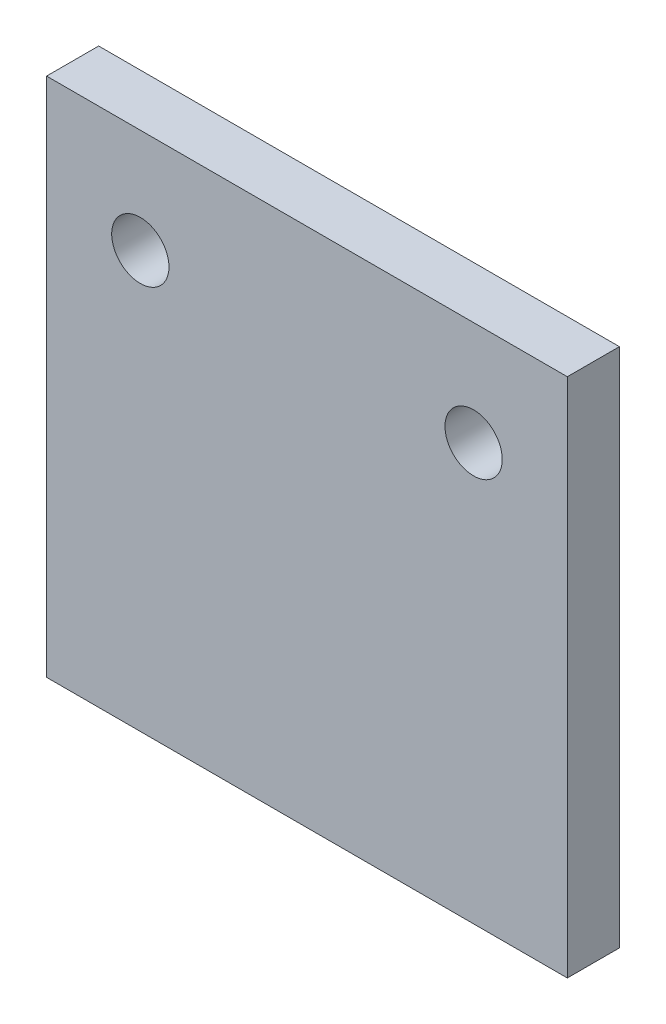
ISO-10303-21;
HEADER;
FILE_DESCRIPTION(('STEP AP214'),'2;1');
FILE_NAME('part.step','',(''),(''),'','','');
FILE_SCHEMA(('AUTOMOTIVE_DESIGN { 1 0 10303 214 1 1 1 1 }'));
ENDSEC;
DATA;
#1=APPLICATION_CONTEXT('core data for automotive mechanical design processes');
#2=APPLICATION_PROTOCOL_DEFINITION('international standard','automotive_design',2000,#1);
#3=PRODUCT_CONTEXT('',#1,'mechanical');
#4=PRODUCT('Part','Part','',(#3));
#5=PRODUCT_RELATED_PRODUCT_CATEGORY('part','',(#4));
#6=PRODUCT_DEFINITION_FORMATION('','',#4);
#7=PRODUCT_DEFINITION_CONTEXT('part definition',#1,'design');
#8=PRODUCT_DEFINITION('design','',#6,#7);
#9=PRODUCT_DEFINITION_SHAPE('','',#8);
#10=(LENGTH_UNIT() NAMED_UNIT(*) SI_UNIT(.MILLI.,.METRE.));
#11=(NAMED_UNIT(*) PLANE_ANGLE_UNIT() SI_UNIT($,.RADIAN.));
#12=(NAMED_UNIT(*) SI_UNIT($,.STERADIAN.) SOLID_ANGLE_UNIT());
#13=UNCERTAINTY_MEASURE_WITH_UNIT(LENGTH_MEASURE(1.E-05),#10,'distance_accuracy_value','');
#14=(GEOMETRIC_REPRESENTATION_CONTEXT(3) GLOBAL_UNCERTAINTY_ASSIGNED_CONTEXT((#13)) GLOBAL_UNIT_ASSIGNED_CONTEXT((#10,
#11,#12)) REPRESENTATION_CONTEXT('',''));
#15=CARTESIAN_POINT('',(0.,0.,0.));
#16=DIRECTION('',(0.,0.,1.));
#17=DIRECTION('',(1.,0.,0.));
#18=AXIS2_PLACEMENT_3D('',#15,#16,#17);
#19=CARTESIAN_POINT('',(25.,25.,5.));
#20=DIRECTION('',(-1.,0.,0.));
#21=DIRECTION('',(0.,-1.,0.));
#22=AXIS2_PLACEMENT_3D('',#19,#20,#21);
#23=PLANE('',#22);
#24=DIRECTION('',(0.,1.,0.));
#25=VECTOR('',#24,1.);
#26=CARTESIAN_POINT('',(25.,25.,0.));
#27=LINE('',#26,#25);
#28=CARTESIAN_POINT('',(25.,-25.,0.));
#29=VERTEX_POINT('',#28);
#30=CARTESIAN_POINT('',(25.,25.,0.));
#31=VERTEX_POINT('',#30);
#32=EDGE_CURVE('E113',#29,#31,#27,.T.);
#33=ORIENTED_EDGE('',*,*,#32,.T.);
#34=DIRECTION('',(0.,0.,-1.));
#35=VECTOR('',#34,1.);
#36=CARTESIAN_POINT('',(25.,25.,5.));
#37=LINE('',#36,#35);
#38=CARTESIAN_POINT('',(25.,25.,5.));
#39=VERTEX_POINT('',#38);
#40=EDGE_CURVE('E11',#39,#31,#37,.T.);
#41=ORIENTED_EDGE('',*,*,#40,.F.);
#42=DIRECTION('',(0.,1.,0.));
#43=VECTOR('',#42,1.);
#44=CARTESIAN_POINT('',(25.,25.,5.));
#45=LINE('',#44,#43);
#46=CARTESIAN_POINT('',(25.,-25.,5.));
#47=VERTEX_POINT('',#46);
#48=EDGE_CURVE('E96',#47,#39,#45,.T.);
#49=ORIENTED_EDGE('',*,*,#48,.F.);
#50=DIRECTION('',(0.,0.,-1.));
#51=VECTOR('',#50,1.);
#52=CARTESIAN_POINT('',(25.,-25.,5.));
#53=LINE('',#52,#51);
#54=EDGE_CURVE('E109',#47,#29,#53,.T.);
#55=ORIENTED_EDGE('',*,*,#54,.T.);
#56=EDGE_LOOP('',(#33,#41,#49,#55));
#57=FACE_BOUND('',#56,.T.);
#58=ADVANCED_FACE('F42',(#57),#23,.F.);
#59=CARTESIAN_POINT('',(-25.,25.,5.));
#60=DIRECTION('',(0.,-1.,0.));
#61=DIRECTION('',(0.,0.,-1.));
#62=AXIS2_PLACEMENT_3D('',#59,#60,#61);
#63=PLANE('',#62);
#64=DIRECTION('',(-1.,0.,0.));
#65=VECTOR('',#64,1.);
#66=CARTESIAN_POINT('',(-25.,25.,0.));
#67=LINE('',#66,#65);
#68=CARTESIAN_POINT('',(-25.,25.,0.));
#69=VERTEX_POINT('',#68);
#70=EDGE_CURVE('E101',#31,#69,#67,.T.);
#71=ORIENTED_EDGE('',*,*,#70,.T.);
#72=DIRECTION('',(0.,0.,-1.));
#73=VECTOR('',#72,1.);
#74=CARTESIAN_POINT('',(-25.,25.,5.));
#75=LINE('',#74,#73);
#76=CARTESIAN_POINT('',(-25.,25.,5.));
#77=VERTEX_POINT('',#76);
#78=EDGE_CURVE('E52',#77,#69,#75,.T.);
#79=ORIENTED_EDGE('',*,*,#78,.F.);
#80=DIRECTION('',(-1.,0.,0.));
#81=VECTOR('',#80,1.);
#82=CARTESIAN_POINT('',(-25.,25.,5.));
#83=LINE('',#82,#81);
#84=EDGE_CURVE('E91',#39,#77,#83,.T.);
#85=ORIENTED_EDGE('',*,*,#84,.F.);
#86=ORIENTED_EDGE('',*,*,#40,.T.);
#87=EDGE_LOOP('',(#71,#79,#85,#86));
#88=FACE_BOUND('',#87,.T.);
#89=ADVANCED_FACE('F100',(#88),#63,.F.);
#90=CARTESIAN_POINT('',(-25.,25.,5.));
#91=DIRECTION('',(1.,0.,0.));
#92=DIRECTION('',(0.,1.,0.));
#93=AXIS2_PLACEMENT_3D('',#90,#91,#92);
#94=PLANE('',#93);
#95=DIRECTION('',(0.,-1.,0.));
#96=VECTOR('',#95,1.);
#97=CARTESIAN_POINT('',(-25.,25.,0.));
#98=LINE('',#97,#96);
#99=CARTESIAN_POINT('',(-25.,-25.,0.));
#100=VERTEX_POINT('',#99);
#101=EDGE_CURVE('E78',#69,#100,#98,.T.);
#102=ORIENTED_EDGE('',*,*,#101,.T.);
#103=DIRECTION('',(0.,0.,-1.));
#104=VECTOR('',#103,1.);
#105=CARTESIAN_POINT('',(-25.,-25.,5.));
#106=LINE('',#105,#104);
#107=CARTESIAN_POINT('',(-25.,-25.,5.));
#108=VERTEX_POINT('',#107);
#109=EDGE_CURVE('E103',#108,#100,#106,.T.);
#110=ORIENTED_EDGE('',*,*,#109,.F.);
#111=DIRECTION('',(0.,-1.,0.));
#112=VECTOR('',#111,1.);
#113=CARTESIAN_POINT('',(-25.,25.,5.));
#114=LINE('',#113,#112);
#115=EDGE_CURVE('E94',#77,#108,#114,.T.);
#116=ORIENTED_EDGE('',*,*,#115,.F.);
#117=ORIENTED_EDGE('',*,*,#78,.T.);
#118=EDGE_LOOP('',(#102,#110,#116,#117));
#119=FACE_BOUND('',#118,.T.);
#120=ADVANCED_FACE('F105',(#119),#94,.F.);
#121=CARTESIAN_POINT('',(-25.,-25.,5.));
#122=DIRECTION('',(0.,1.,0.));
#123=DIRECTION('',(0.,0.,1.));
#124=AXIS2_PLACEMENT_3D('',#121,#122,#123);
#125=PLANE('',#124);
#126=DIRECTION('',(1.,0.,0.));
#127=VECTOR('',#126,1.);
#128=CARTESIAN_POINT('',(-25.,-25.,0.));
#129=LINE('',#128,#127);
#130=EDGE_CURVE('E84',#100,#29,#129,.T.);
#131=ORIENTED_EDGE('',*,*,#130,.T.);
#132=ORIENTED_EDGE('',*,*,#54,.F.);
#133=DIRECTION('',(1.,0.,0.));
#134=VECTOR('',#133,1.);
#135=CARTESIAN_POINT('',(-25.,-25.,5.));
#136=LINE('',#135,#134);
#137=EDGE_CURVE('E61',#108,#47,#136,.T.);
#138=ORIENTED_EDGE('',*,*,#137,.F.);
#139=ORIENTED_EDGE('',*,*,#109,.T.);
#140=EDGE_LOOP('',(#131,#132,#138,#139));
#141=FACE_BOUND('',#140,.T.);
#142=ADVANCED_FACE('F151',(#141),#125,.F.);
#143=CARTESIAN_POINT('',(0.,0.,5.));
#144=DIRECTION('',(0.,0.,1.));
#145=DIRECTION('',(1.,0.,0.));
#146=AXIS2_PLACEMENT_3D('',#143,#144,#145);
#147=PLANE('',#146);
#148=CARTESIAN_POINT('',(-16.,15.,5.));
#149=DIRECTION('',(0.,0.,1.));
#150=DIRECTION('',(1.,0.,0.));
#151=AXIS2_PLACEMENT_3D('',#148,#149,#150);
#152=CIRCLE('',#151,2.75);
#153=CARTESIAN_POINT('',(-13.25,15.,5.));
#154=VERTEX_POINT('',#153);
#155=EDGE_CURVE('E129',#154,#154,#152,.T.);
#156=ORIENTED_EDGE('',*,*,#155,.F.);
#157=EDGE_LOOP('',(#156));
#158=FACE_BOUND('',#157,.T.);
#159=CARTESIAN_POINT('',(16.,15.,5.));
#160=DIRECTION('',(0.,0.,1.));
#161=DIRECTION('',(1.,0.,0.));
#162=AXIS2_PLACEMENT_3D('',#159,#160,#161);
#163=CIRCLE('',#162,2.75);
#164=CARTESIAN_POINT('',(18.75,15.,5.));
#165=VERTEX_POINT('',#164);
#166=EDGE_CURVE('E136',#165,#165,#163,.T.);
#167=ORIENTED_EDGE('',*,*,#166,.F.);
#168=EDGE_LOOP('',(#167));
#169=FACE_BOUND('',#168,.T.);
#170=ORIENTED_EDGE('',*,*,#48,.T.);
#171=ORIENTED_EDGE('',*,*,#84,.T.);
#172=ORIENTED_EDGE('',*,*,#115,.T.);
#173=ORIENTED_EDGE('',*,*,#137,.T.);
#174=EDGE_LOOP('',(#170,#171,#172,#173));
#175=FACE_BOUND('',#174,.T.);
#176=ADVANCED_FACE('F92',(#158,#169,#175),#147,.T.);
#177=CARTESIAN_POINT('',(0.,0.,0.));
#178=DIRECTION('',(0.,0.,1.));
#179=DIRECTION('',(1.,0.,0.));
#180=AXIS2_PLACEMENT_3D('',#177,#178,#179);
#181=PLANE('',#180);
#182=CARTESIAN_POINT('',(-16.,15.,0.));
#183=DIRECTION('',(0.,0.,1.));
#184=DIRECTION('',(1.,0.,0.));
#185=AXIS2_PLACEMENT_3D('',#182,#183,#184);
#186=CIRCLE('',#185,2.75);
#187=CARTESIAN_POINT('',(-13.25,15.,0.));
#188=VERTEX_POINT('',#187);
#189=EDGE_CURVE('E45',#188,#188,#186,.T.);
#190=ORIENTED_EDGE('',*,*,#189,.T.);
#191=EDGE_LOOP('',(#190));
#192=FACE_BOUND('',#191,.T.);
#193=CARTESIAN_POINT('',(16.,15.,0.));
#194=DIRECTION('',(0.,0.,1.));
#195=DIRECTION('',(1.,0.,0.));
#196=AXIS2_PLACEMENT_3D('',#193,#194,#195);
#197=CIRCLE('',#196,2.75);
#198=CARTESIAN_POINT('',(18.75,15.,0.));
#199=VERTEX_POINT('',#198);
#200=EDGE_CURVE('E126',#199,#199,#197,.T.);
#201=ORIENTED_EDGE('',*,*,#200,.T.);
#202=EDGE_LOOP('',(#201));
#203=FACE_BOUND('',#202,.T.);
#204=ORIENTED_EDGE('',*,*,#32,.F.);
#205=ORIENTED_EDGE('',*,*,#130,.F.);
#206=ORIENTED_EDGE('',*,*,#101,.F.);
#207=ORIENTED_EDGE('',*,*,#70,.F.);
#208=EDGE_LOOP('',(#204,#205,#206,#207));
#209=FACE_BOUND('',#208,.T.);
#210=ADVANCED_FACE('F150',(#192,#203,#209),#181,.F.);
#211=CARTESIAN_POINT('',(16.,15.,-5.));
#212=DIRECTION('',(0.,0.,1.));
#213=DIRECTION('',(1.,0.,0.));
#214=AXIS2_PLACEMENT_3D('',#211,#212,#213);
#215=CYLINDRICAL_SURFACE('',#214,2.75);
#216=ORIENTED_EDGE('',*,*,#166,.T.);
#217=EDGE_LOOP('',(#216));
#218=FACE_BOUND('',#217,.T.);
#219=ORIENTED_EDGE('',*,*,#200,.F.);
#220=EDGE_LOOP('',(#219));
#221=FACE_BOUND('',#220,.T.);
#222=ADVANCED_FACE('F146',(#218,#221),#215,.F.);
#223=CARTESIAN_POINT('',(-16.,15.,-5.));
#224=DIRECTION('',(0.,0.,1.));
#225=DIRECTION('',(1.,0.,0.));
#226=AXIS2_PLACEMENT_3D('',#223,#224,#225);
#227=CYLINDRICAL_SURFACE('',#226,2.75);
#228=ORIENTED_EDGE('',*,*,#155,.T.);
#229=EDGE_LOOP('',(#228));
#230=FACE_BOUND('',#229,.T.);
#231=ORIENTED_EDGE('',*,*,#189,.F.);
#232=EDGE_LOOP('',(#231));
#233=FACE_BOUND('',#232,.T.);
#234=ADVANCED_FACE('F198',(#230,#233),#227,.F.);
#235=CLOSED_SHELL('',(#58,#89,#120,#142,#176,#210,#222,#234));
#236=MANIFOLD_SOLID_BREP('B2',#235);
#237=ADVANCED_BREP_SHAPE_REPRESENTATION('',(#18,#236),#14);
#238=SHAPE_DEFINITION_REPRESENTATION(#9,#237);
ENDSEC;
END-ISO-10303-21;
